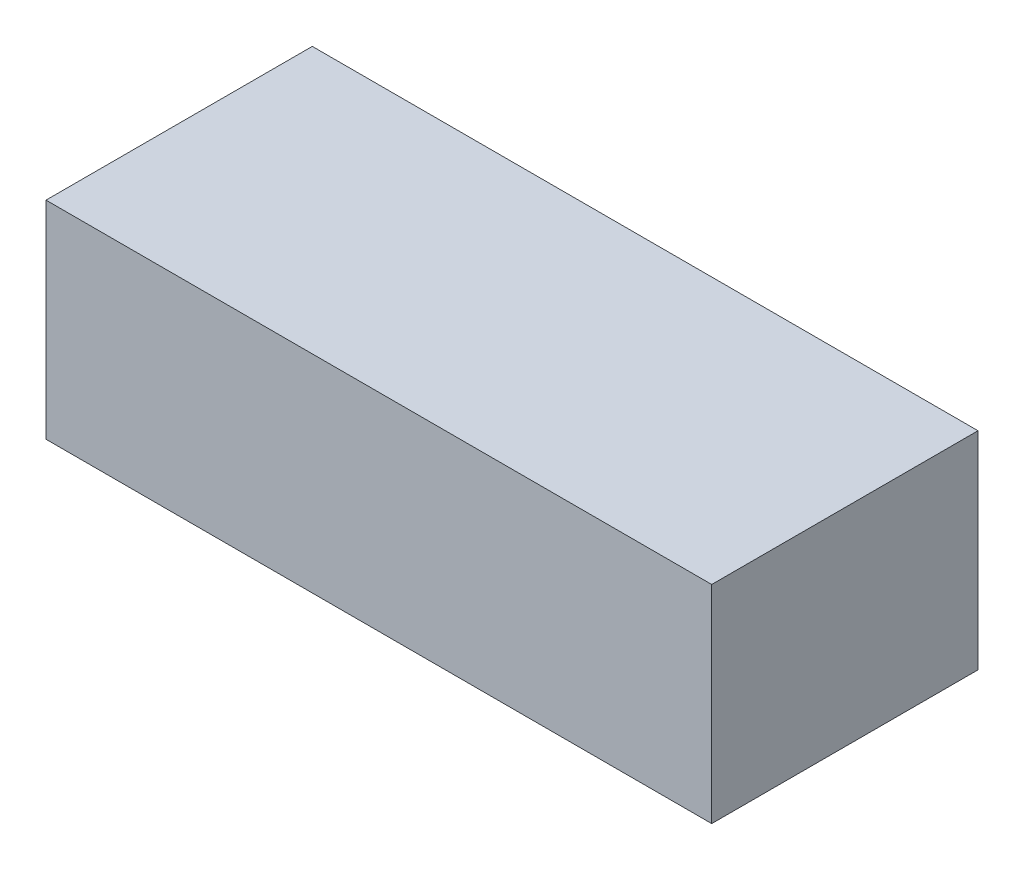
ISO-10303-21;
HEADER;
FILE_DESCRIPTION(('STEP AP214'),'2;1');
FILE_NAME('part.step','',(''),(''),'','','');
FILE_SCHEMA(('AUTOMOTIVE_DESIGN { 1 0 10303 214 1 1 1 1 }'));
ENDSEC;
DATA;
#1=APPLICATION_CONTEXT('core data for automotive mechanical design processes');
#2=APPLICATION_PROTOCOL_DEFINITION('international standard','automotive_design',2000,#1);
#3=PRODUCT_CONTEXT('',#1,'mechanical');
#4=PRODUCT('Part','Part','',(#3));
#5=PRODUCT_RELATED_PRODUCT_CATEGORY('part','',(#4));
#6=PRODUCT_DEFINITION_FORMATION('','',#4);
#7=PRODUCT_DEFINITION_CONTEXT('part definition',#1,'design');
#8=PRODUCT_DEFINITION('design','',#6,#7);
#9=PRODUCT_DEFINITION_SHAPE('','',#8);
#10=(LENGTH_UNIT() NAMED_UNIT(*) SI_UNIT(.MILLI.,.METRE.));
#11=(NAMED_UNIT(*) PLANE_ANGLE_UNIT() SI_UNIT($,.RADIAN.));
#12=(NAMED_UNIT(*) SI_UNIT($,.STERADIAN.) SOLID_ANGLE_UNIT());
#13=UNCERTAINTY_MEASURE_WITH_UNIT(LENGTH_MEASURE(1.E-05),#10,'distance_accuracy_value','');
#14=(GEOMETRIC_REPRESENTATION_CONTEXT(3) GLOBAL_UNCERTAINTY_ASSIGNED_CONTEXT((#13)) GLOBAL_UNIT_ASSIGNED_CONTEXT((#10,
#11,#12)) REPRESENTATION_CONTEXT('',''));
#15=CARTESIAN_POINT('',(0.,0.,0.));
#16=DIRECTION('',(0.,0.,1.));
#17=DIRECTION('',(1.,0.,0.));
#18=AXIS2_PLACEMENT_3D('',#15,#16,#17);
#19=CARTESIAN_POINT('',(112.5,70.,45.));
#20=DIRECTION('',(-1.,0.,0.));
#21=DIRECTION('',(0.,0.,1.));
#22=AXIS2_PLACEMENT_3D('',#19,#20,#21);
#23=PLANE('',#22);
#24=DIRECTION('',(0.,0.,-1.));
#25=VECTOR('',#24,1.);
#26=CARTESIAN_POINT('',(112.5,0.,45.));
#27=LINE('',#26,#25);
#28=CARTESIAN_POINT('',(112.5,0.,45.));
#29=VERTEX_POINT('',#28);
#30=CARTESIAN_POINT('',(112.5,0.,-45.));
#31=VERTEX_POINT('',#30);
#32=EDGE_CURVE('E96',#29,#31,#27,.T.);
#33=ORIENTED_EDGE('',*,*,#32,.T.);
#34=DIRECTION('',(0.,-1.,0.));
#35=VECTOR('',#34,1.);
#36=CARTESIAN_POINT('',(112.5,70.,-45.));
#37=LINE('',#36,#35);
#38=CARTESIAN_POINT('',(112.5,70.,-45.));
#39=VERTEX_POINT('',#38);
#40=EDGE_CURVE('E11',#39,#31,#37,.T.);
#41=ORIENTED_EDGE('',*,*,#40,.F.);
#42=DIRECTION('',(0.,0.,-1.));
#43=VECTOR('',#42,1.);
#44=CARTESIAN_POINT('',(112.5,70.,45.));
#45=LINE('',#44,#43);
#46=CARTESIAN_POINT('',(112.5,70.,45.));
#47=VERTEX_POINT('',#46);
#48=EDGE_CURVE('E84',#47,#39,#45,.T.);
#49=ORIENTED_EDGE('',*,*,#48,.F.);
#50=DIRECTION('',(0.,-1.,0.));
#51=VECTOR('',#50,1.);
#52=CARTESIAN_POINT('',(112.5,70.,45.));
#53=LINE('',#52,#51);
#54=EDGE_CURVE('E92',#47,#29,#53,.T.);
#55=ORIENTED_EDGE('',*,*,#54,.T.);
#56=EDGE_LOOP('',(#33,#41,#49,#55));
#57=FACE_BOUND('',#56,.T.);
#58=ADVANCED_FACE('F33',(#57),#23,.F.);
#59=CARTESIAN_POINT('',(-112.5,70.,-45.));
#60=DIRECTION('',(0.,0.,1.));
#61=DIRECTION('',(1.,0.,0.));
#62=AXIS2_PLACEMENT_3D('',#59,#60,#61);
#63=PLANE('',#62);
#64=DIRECTION('',(-1.,0.,0.));
#65=VECTOR('',#64,1.);
#66=CARTESIAN_POINT('',(-112.5,0.,-45.));
#67=LINE('',#66,#65);
#68=CARTESIAN_POINT('',(-112.5,0.,-45.));
#69=VERTEX_POINT('',#68);
#70=EDGE_CURVE('E88',#31,#69,#67,.T.);
#71=ORIENTED_EDGE('',*,*,#70,.T.);
#72=DIRECTION('',(0.,-1.,0.));
#73=VECTOR('',#72,1.);
#74=CARTESIAN_POINT('',(-112.5,70.,-45.));
#75=LINE('',#74,#73);
#76=CARTESIAN_POINT('',(-112.5,70.,-45.));
#77=VERTEX_POINT('',#76);
#78=EDGE_CURVE('E41',#77,#69,#75,.T.);
#79=ORIENTED_EDGE('',*,*,#78,.F.);
#80=DIRECTION('',(-1.,0.,0.));
#81=VECTOR('',#80,1.);
#82=CARTESIAN_POINT('',(-112.5,70.,-45.));
#83=LINE('',#82,#81);
#84=EDGE_CURVE('E79',#39,#77,#83,.T.);
#85=ORIENTED_EDGE('',*,*,#84,.F.);
#86=ORIENTED_EDGE('',*,*,#40,.T.);
#87=EDGE_LOOP('',(#71,#79,#85,#86));
#88=FACE_BOUND('',#87,.T.);
#89=ADVANCED_FACE('F87',(#88),#63,.F.);
#90=CARTESIAN_POINT('',(-112.5,70.,45.));
#91=DIRECTION('',(1.,0.,0.));
#92=DIRECTION('',(0.,0.,-1.));
#93=AXIS2_PLACEMENT_3D('',#90,#91,#92);
#94=PLANE('',#93);
#95=DIRECTION('',(0.,0.,1.));
#96=VECTOR('',#95,1.);
#97=CARTESIAN_POINT('',(-112.5,0.,45.));
#98=LINE('',#97,#96);
#99=CARTESIAN_POINT('',(-112.5,0.,45.));
#100=VERTEX_POINT('',#99);
#101=EDGE_CURVE('E66',#69,#100,#98,.T.);
#102=ORIENTED_EDGE('',*,*,#101,.T.);
#103=DIRECTION('',(0.,-1.,0.));
#104=VECTOR('',#103,1.);
#105=CARTESIAN_POINT('',(-112.5,70.,45.));
#106=LINE('',#105,#104);
#107=CARTESIAN_POINT('',(-112.5,70.,45.));
#108=VERTEX_POINT('',#107);
#109=EDGE_CURVE('E89',#108,#100,#106,.T.);
#110=ORIENTED_EDGE('',*,*,#109,.F.);
#111=DIRECTION('',(0.,0.,1.));
#112=VECTOR('',#111,1.);
#113=CARTESIAN_POINT('',(-112.5,70.,45.));
#114=LINE('',#113,#112);
#115=EDGE_CURVE('E82',#77,#108,#114,.T.);
#116=ORIENTED_EDGE('',*,*,#115,.F.);
#117=ORIENTED_EDGE('',*,*,#78,.T.);
#118=EDGE_LOOP('',(#102,#110,#116,#117));
#119=FACE_BOUND('',#118,.T.);
#120=ADVANCED_FACE('F90',(#119),#94,.F.);
#121=CARTESIAN_POINT('',(-112.5,70.,45.));
#122=DIRECTION('',(0.,0.,-1.));
#123=DIRECTION('',(-1.,0.,0.));
#124=AXIS2_PLACEMENT_3D('',#121,#122,#123);
#125=PLANE('',#124);
#126=DIRECTION('',(1.,0.,0.));
#127=VECTOR('',#126,1.);
#128=CARTESIAN_POINT('',(-112.5,0.,45.));
#129=LINE('',#128,#127);
#130=EDGE_CURVE('E72',#100,#29,#129,.T.);
#131=ORIENTED_EDGE('',*,*,#130,.T.);
#132=ORIENTED_EDGE('',*,*,#54,.F.);
#133=DIRECTION('',(1.,0.,0.));
#134=VECTOR('',#133,1.);
#135=CARTESIAN_POINT('',(-112.5,70.,45.));
#136=LINE('',#135,#134);
#137=EDGE_CURVE('E49',#108,#47,#136,.T.);
#138=ORIENTED_EDGE('',*,*,#137,.F.);
#139=ORIENTED_EDGE('',*,*,#109,.T.);
#140=EDGE_LOOP('',(#131,#132,#138,#139));
#141=FACE_BOUND('',#140,.T.);
#142=ADVANCED_FACE('F103',(#141),#125,.F.);
#143=CARTESIAN_POINT('',(0.,70.,0.));
#144=DIRECTION('',(0.,-1.,0.));
#145=DIRECTION('',(0.,0.,-1.));
#146=AXIS2_PLACEMENT_3D('',#143,#144,#145);
#147=PLANE('',#146);
#148=ORIENTED_EDGE('',*,*,#48,.T.);
#149=ORIENTED_EDGE('',*,*,#84,.T.);
#150=ORIENTED_EDGE('',*,*,#115,.T.);
#151=ORIENTED_EDGE('',*,*,#137,.T.);
#152=EDGE_LOOP('',(#148,#149,#150,#151));
#153=FACE_BOUND('',#152,.T.);
#154=ADVANCED_FACE('F80',(#153),#147,.F.);
#155=CARTESIAN_POINT('',(0.,0.,0.));
#156=DIRECTION('',(0.,-1.,0.));
#157=DIRECTION('',(0.,0.,-1.));
#158=AXIS2_PLACEMENT_3D('',#155,#156,#157);
#159=PLANE('',#158);
#160=ORIENTED_EDGE('',*,*,#32,.F.);
#161=ORIENTED_EDGE('',*,*,#130,.F.);
#162=ORIENTED_EDGE('',*,*,#101,.F.);
#163=ORIENTED_EDGE('',*,*,#70,.F.);
#164=EDGE_LOOP('',(#160,#161,#162,#163));
#165=FACE_BOUND('',#164,.T.);
#166=ADVANCED_FACE('F106',(#165),#159,.T.);
#167=CLOSED_SHELL('',(#58,#89,#120,#142,#154,#166));
#168=MANIFOLD_SOLID_BREP('B2',#167);
#169=ADVANCED_BREP_SHAPE_REPRESENTATION('',(#18,#168),#14);
#170=SHAPE_DEFINITION_REPRESENTATION(#9,#169);
ENDSEC;
END-ISO-10303-21;
